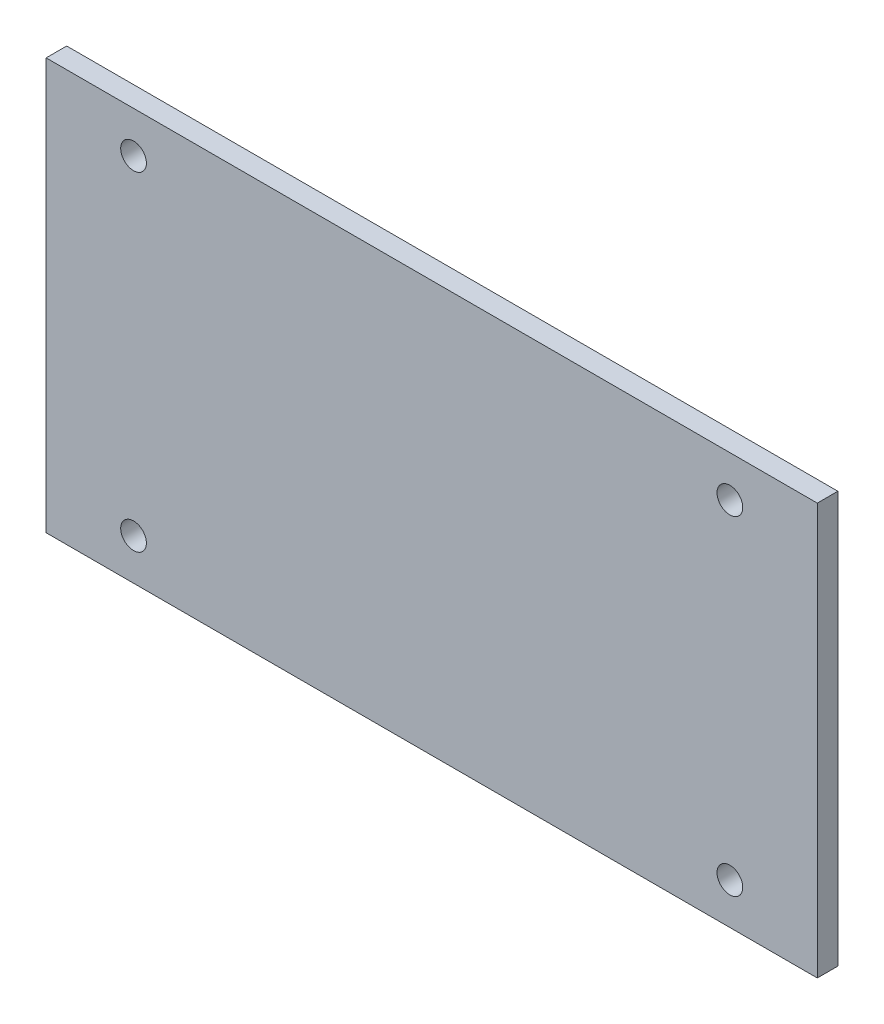
ISO-10303-21;
HEADER;
FILE_DESCRIPTION(('STEP AP214'),'2;1');
FILE_NAME('part.step','',(''),(''),'','','');
FILE_SCHEMA(('AUTOMOTIVE_DESIGN { 1 0 10303 214 1 1 1 1 }'));
ENDSEC;
DATA;
#1=APPLICATION_CONTEXT('core data for automotive mechanical design processes');
#2=APPLICATION_PROTOCOL_DEFINITION('international standard','automotive_design',2000,#1);
#3=PRODUCT_CONTEXT('',#1,'mechanical');
#4=PRODUCT('Part','Part','',(#3));
#5=PRODUCT_RELATED_PRODUCT_CATEGORY('part','',(#4));
#6=PRODUCT_DEFINITION_FORMATION('','',#4);
#7=PRODUCT_DEFINITION_CONTEXT('part definition',#1,'design');
#8=PRODUCT_DEFINITION('design','',#6,#7);
#9=PRODUCT_DEFINITION_SHAPE('','',#8);
#10=(LENGTH_UNIT() NAMED_UNIT(*) SI_UNIT(.MILLI.,.METRE.));
#11=(NAMED_UNIT(*) PLANE_ANGLE_UNIT() SI_UNIT($,.RADIAN.));
#12=(NAMED_UNIT(*) SI_UNIT($,.STERADIAN.) SOLID_ANGLE_UNIT());
#13=UNCERTAINTY_MEASURE_WITH_UNIT(LENGTH_MEASURE(1.E-05),#10,'distance_accuracy_value','');
#14=(GEOMETRIC_REPRESENTATION_CONTEXT(3) GLOBAL_UNCERTAINTY_ASSIGNED_CONTEXT((#13)) GLOBAL_UNIT_ASSIGNED_CONTEXT((#10,
#11,#12)) REPRESENTATION_CONTEXT('',''));
#15=CARTESIAN_POINT('',(0.,0.,0.));
#16=DIRECTION('',(0.,0.,1.));
#17=DIRECTION('',(1.,0.,0.));
#18=AXIS2_PLACEMENT_3D('',#15,#16,#17);
#19=CARTESIAN_POINT('',(0.,0.,4.));
#20=DIRECTION('',(0.,0.,1.));
#21=DIRECTION('',(1.,0.,0.));
#22=AXIS2_PLACEMENT_3D('',#19,#20,#21);
#23=PLANE('',#22);
#24=CARTESIAN_POINT('',(78.3442624253228,39.9499153350629,4.));
#25=DIRECTION('',(0.,0.,1.));
#26=DIRECTION('',(1.,0.,0.));
#27=AXIS2_PLACEMENT_3D('',#24,#25,#26);
#28=CIRCLE('',#27,2.50000000000001);
#29=CARTESIAN_POINT('',(80.8442624253228,39.9499153350629,4.));
#30=VERTEX_POINT('',#29);
#31=EDGE_CURVE('E121',#30,#30,#28,.T.);
#32=ORIENTED_EDGE('',*,*,#31,.F.);
#33=EDGE_LOOP('',(#32));
#34=FACE_BOUND('',#33,.T.);
#35=CARTESIAN_POINT('',(-37.6557375746772,39.9499153350629,4.));
#36=DIRECTION('',(0.,0.,1.));
#37=DIRECTION('',(1.,0.,0.));
#38=AXIS2_PLACEMENT_3D('',#35,#36,#37);
#39=CIRCLE('',#38,2.5);
#40=CARTESIAN_POINT('',(-35.1557375746772,39.9499153350629,4.));
#41=VERTEX_POINT('',#40);
#42=EDGE_CURVE('E100',#41,#41,#39,.T.);
#43=ORIENTED_EDGE('',*,*,#42,.F.);
#44=EDGE_LOOP('',(#43));
#45=FACE_BOUND('',#44,.T.);
#46=DIRECTION('',(0.,-1.,0.));
#47=VECTOR('',#46,1.);
#48=CARTESIAN_POINT('',(-54.6557375746772,47.9499153350629,4.));
#49=LINE('',#48,#47);
#50=CARTESIAN_POINT('',(-54.6557375746772,47.9499153350629,4.));
#51=VERTEX_POINT('',#50);
#52=CARTESIAN_POINT('',(-54.6557375746772,-32.0500846649371,4.));
#53=VERTEX_POINT('',#52);
#54=EDGE_CURVE('E85',#51,#53,#49,.T.);
#55=ORIENTED_EDGE('',*,*,#54,.T.);
#56=DIRECTION('',(1.,0.,0.));
#57=VECTOR('',#56,1.);
#58=CARTESIAN_POINT('',(-54.6557375746772,-32.0500846649371,4.));
#59=LINE('',#58,#57);
#60=CARTESIAN_POINT('',(95.3442624253228,-32.0500846649371,4.));
#61=VERTEX_POINT('',#60);
#62=EDGE_CURVE('E80',#53,#61,#59,.T.);
#63=ORIENTED_EDGE('',*,*,#62,.T.);
#64=DIRECTION('',(0.,1.,0.));
#65=VECTOR('',#64,1.);
#66=CARTESIAN_POINT('',(95.3442624253228,47.9499153350629,4.));
#67=LINE('',#66,#65);
#68=CARTESIAN_POINT('',(95.3442624253228,47.9499153350629,4.));
#69=VERTEX_POINT('',#68);
#70=EDGE_CURVE('E83',#61,#69,#67,.T.);
#71=ORIENTED_EDGE('',*,*,#70,.T.);
#72=DIRECTION('',(-1.,0.,0.));
#73=VECTOR('',#72,1.);
#74=CARTESIAN_POINT('',(-54.6557375746772,47.9499153350629,4.));
#75=LINE('',#74,#73);
#76=EDGE_CURVE('E50',#69,#51,#75,.T.);
#77=ORIENTED_EDGE('',*,*,#76,.T.);
#78=EDGE_LOOP('',(#55,#63,#71,#77));
#79=FACE_BOUND('',#78,.T.);
#80=CARTESIAN_POINT('',(-37.6557375746772,-24.0500846649371,4.));
#81=DIRECTION('',(0.,0.,1.));
#82=DIRECTION('',(1.,0.,0.));
#83=AXIS2_PLACEMENT_3D('',#80,#81,#82);
#84=CIRCLE('',#83,2.5);
#85=CARTESIAN_POINT('',(-35.1557375746772,-24.0500846649371,4.));
#86=VERTEX_POINT('',#85);
#87=EDGE_CURVE('E115',#86,#86,#84,.T.);
#88=ORIENTED_EDGE('',*,*,#87,.F.);
#89=EDGE_LOOP('',(#88));
#90=FACE_BOUND('',#89,.T.);
#91=CARTESIAN_POINT('',(78.3442624253228,-24.0500846649371,4.));
#92=DIRECTION('',(0.,0.,1.));
#93=DIRECTION('',(1.,0.,0.));
#94=AXIS2_PLACEMENT_3D('',#91,#92,#93);
#95=CIRCLE('',#94,2.5);
#96=CARTESIAN_POINT('',(80.8442624253228,-24.0500846649371,4.));
#97=VERTEX_POINT('',#96);
#98=EDGE_CURVE('E127',#97,#97,#95,.T.);
#99=ORIENTED_EDGE('',*,*,#98,.F.);
#100=EDGE_LOOP('',(#99));
#101=FACE_BOUND('',#100,.T.);
#102=ADVANCED_FACE('F33',(#34,#45,#79,#90,#101),#23,.T.);
#103=CARTESIAN_POINT('',(0.,0.,0.));
#104=DIRECTION('',(0.,0.,1.));
#105=DIRECTION('',(1.,0.,0.));
#106=AXIS2_PLACEMENT_3D('',#103,#104,#105);
#107=PLANE('',#106);
#108=DIRECTION('',(0.,-1.,0.));
#109=VECTOR('',#108,1.);
#110=CARTESIAN_POINT('',(-54.6557375746772,47.9499153350629,0.));
#111=LINE('',#110,#109);
#112=CARTESIAN_POINT('',(-54.6557375746772,47.9499153350629,0.));
#113=VERTEX_POINT('',#112);
#114=CARTESIAN_POINT('',(-54.6557375746772,-32.0500846649371,0.));
#115=VERTEX_POINT('',#114);
#116=EDGE_CURVE('E97',#113,#115,#111,.T.);
#117=ORIENTED_EDGE('',*,*,#116,.F.);
#118=DIRECTION('',(-1.,0.,0.));
#119=VECTOR('',#118,1.);
#120=CARTESIAN_POINT('',(-54.6557375746772,47.9499153350629,0.));
#121=LINE('',#120,#119);
#122=CARTESIAN_POINT('',(95.3442624253228,47.9499153350629,0.));
#123=VERTEX_POINT('',#122);
#124=EDGE_CURVE('E73',#123,#113,#121,.T.);
#125=ORIENTED_EDGE('',*,*,#124,.F.);
#126=DIRECTION('',(0.,1.,0.));
#127=VECTOR('',#126,1.);
#128=CARTESIAN_POINT('',(95.3442624253228,47.9499153350629,0.));
#129=LINE('',#128,#127);
#130=CARTESIAN_POINT('',(95.3442624253228,-32.0500846649371,0.));
#131=VERTEX_POINT('',#130);
#132=EDGE_CURVE('E67',#131,#123,#129,.T.);
#133=ORIENTED_EDGE('',*,*,#132,.F.);
#134=DIRECTION('',(1.,0.,0.));
#135=VECTOR('',#134,1.);
#136=CARTESIAN_POINT('',(-54.6557375746772,-32.0500846649371,0.));
#137=LINE('',#136,#135);
#138=EDGE_CURVE('E89',#115,#131,#137,.T.);
#139=ORIENTED_EDGE('',*,*,#138,.F.);
#140=EDGE_LOOP('',(#117,#125,#133,#139));
#141=FACE_BOUND('',#140,.T.);
#142=CARTESIAN_POINT('',(-37.6557375746772,39.9499153350629,0.));
#143=DIRECTION('',(0.,0.,1.));
#144=DIRECTION('',(1.,0.,0.));
#145=AXIS2_PLACEMENT_3D('',#142,#143,#144);
#146=CIRCLE('',#145,2.5);
#147=CARTESIAN_POINT('',(-35.1557375746772,39.9499153350629,0.));
#148=VERTEX_POINT('',#147);
#149=EDGE_CURVE('E112',#148,#148,#146,.T.);
#150=ORIENTED_EDGE('',*,*,#149,.T.);
#151=EDGE_LOOP('',(#150));
#152=FACE_BOUND('',#151,.T.);
#153=CARTESIAN_POINT('',(-37.6557375746772,-24.0500846649371,0.));
#154=DIRECTION('',(0.,0.,1.));
#155=DIRECTION('',(1.,0.,0.));
#156=AXIS2_PLACEMENT_3D('',#153,#154,#155);
#157=CIRCLE('',#156,2.5);
#158=CARTESIAN_POINT('',(-35.1557375746772,-24.0500846649371,0.));
#159=VERTEX_POINT('',#158);
#160=EDGE_CURVE('E118',#159,#159,#157,.T.);
#161=ORIENTED_EDGE('',*,*,#160,.T.);
#162=EDGE_LOOP('',(#161));
#163=FACE_BOUND('',#162,.T.);
#164=CARTESIAN_POINT('',(78.3442624253228,39.9499153350629,0.));
#165=DIRECTION('',(0.,0.,1.));
#166=DIRECTION('',(1.,0.,0.));
#167=AXIS2_PLACEMENT_3D('',#164,#165,#166);
#168=CIRCLE('',#167,2.50000000000001);
#169=CARTESIAN_POINT('',(80.8442624253228,39.9499153350629,0.));
#170=VERTEX_POINT('',#169);
#171=EDGE_CURVE('E124',#170,#170,#168,.T.);
#172=ORIENTED_EDGE('',*,*,#171,.T.);
#173=EDGE_LOOP('',(#172));
#174=FACE_BOUND('',#173,.T.);
#175=CARTESIAN_POINT('',(78.3442624253228,-24.0500846649371,0.));
#176=DIRECTION('',(0.,0.,1.));
#177=DIRECTION('',(1.,0.,0.));
#178=AXIS2_PLACEMENT_3D('',#175,#176,#177);
#179=CIRCLE('',#178,2.5);
#180=CARTESIAN_POINT('',(80.8442624253228,-24.0500846649371,0.));
#181=VERTEX_POINT('',#180);
#182=EDGE_CURVE('E130',#181,#181,#179,.T.);
#183=ORIENTED_EDGE('',*,*,#182,.T.);
#184=EDGE_LOOP('',(#183));
#185=FACE_BOUND('',#184,.T.);
#186=ADVANCED_FACE('F108',(#141,#152,#163,#174,#185),#107,.F.);
#187=CARTESIAN_POINT('',(-54.6557375746772,47.9499153350629,4.));
#188=DIRECTION('',(1.,0.,0.));
#189=DIRECTION('',(0.,1.,0.));
#190=AXIS2_PLACEMENT_3D('',#187,#188,#189);
#191=PLANE('',#190);
#192=ORIENTED_EDGE('',*,*,#116,.T.);
#193=DIRECTION('',(0.,0.,-1.));
#194=VECTOR('',#193,1.);
#195=CARTESIAN_POINT('',(-54.6557375746772,-32.0500846649371,4.));
#196=LINE('',#195,#194);
#197=EDGE_CURVE('E11',#53,#115,#196,.T.);
#198=ORIENTED_EDGE('',*,*,#197,.F.);
#199=ORIENTED_EDGE('',*,*,#54,.F.);
#200=DIRECTION('',(0.,0.,-1.));
#201=VECTOR('',#200,1.);
#202=CARTESIAN_POINT('',(-54.6557375746772,47.9499153350629,4.));
#203=LINE('',#202,#201);
#204=EDGE_CURVE('E93',#51,#113,#203,.T.);
#205=ORIENTED_EDGE('',*,*,#204,.T.);
#206=EDGE_LOOP('',(#192,#198,#199,#205));
#207=FACE_BOUND('',#206,.T.);
#208=ADVANCED_FACE('F35',(#207),#191,.F.);
#209=CARTESIAN_POINT('',(-54.6557375746772,-32.0500846649371,4.));
#210=DIRECTION('',(0.,1.,0.));
#211=DIRECTION('',(0.,0.,1.));
#212=AXIS2_PLACEMENT_3D('',#209,#210,#211);
#213=PLANE('',#212);
#214=ORIENTED_EDGE('',*,*,#138,.T.);
#215=DIRECTION('',(0.,0.,-1.));
#216=VECTOR('',#215,1.);
#217=CARTESIAN_POINT('',(95.3442624253228,-32.0500846649371,4.));
#218=LINE('',#217,#216);
#219=EDGE_CURVE('E42',#61,#131,#218,.T.);
#220=ORIENTED_EDGE('',*,*,#219,.F.);
#221=ORIENTED_EDGE('',*,*,#62,.F.);
#222=ORIENTED_EDGE('',*,*,#197,.T.);
#223=EDGE_LOOP('',(#214,#220,#221,#222));
#224=FACE_BOUND('',#223,.T.);
#225=ADVANCED_FACE('F88',(#224),#213,.F.);
#226=CARTESIAN_POINT('',(95.3442624253228,47.9499153350629,4.));
#227=DIRECTION('',(-1.,0.,0.));
#228=DIRECTION('',(0.,-1.,0.));
#229=AXIS2_PLACEMENT_3D('',#226,#227,#228);
#230=PLANE('',#229);
#231=ORIENTED_EDGE('',*,*,#132,.T.);
#232=DIRECTION('',(0.,0.,-1.));
#233=VECTOR('',#232,1.);
#234=CARTESIAN_POINT('',(95.3442624253228,47.9499153350629,4.));
#235=LINE('',#234,#233);
#236=EDGE_CURVE('E90',#69,#123,#235,.T.);
#237=ORIENTED_EDGE('',*,*,#236,.F.);
#238=ORIENTED_EDGE('',*,*,#70,.F.);
#239=ORIENTED_EDGE('',*,*,#219,.T.);
#240=EDGE_LOOP('',(#231,#237,#238,#239));
#241=FACE_BOUND('',#240,.T.);
#242=ADVANCED_FACE('F91',(#241),#230,.F.);
#243=CARTESIAN_POINT('',(-54.6557375746772,47.9499153350629,4.));
#244=DIRECTION('',(0.,-1.,0.));
#245=DIRECTION('',(0.,0.,-1.));
#246=AXIS2_PLACEMENT_3D('',#243,#244,#245);
#247=PLANE('',#246);
#248=ORIENTED_EDGE('',*,*,#124,.T.);
#249=ORIENTED_EDGE('',*,*,#204,.F.);
#250=ORIENTED_EDGE('',*,*,#76,.F.);
#251=ORIENTED_EDGE('',*,*,#236,.T.);
#252=EDGE_LOOP('',(#248,#249,#250,#251));
#253=FACE_BOUND('',#252,.T.);
#254=ADVANCED_FACE('F105',(#253),#247,.F.);
#255=CARTESIAN_POINT('',(-37.6557375746772,39.9499153350629,4.));
#256=DIRECTION('',(0.,0.,-1.));
#257=DIRECTION('',(-1.,0.,0.));
#258=AXIS2_PLACEMENT_3D('',#255,#256,#257);
#259=CYLINDRICAL_SURFACE('',#258,2.5);
#260=ORIENTED_EDGE('',*,*,#42,.T.);
#261=EDGE_LOOP('',(#260));
#262=FACE_BOUND('',#261,.T.);
#263=ORIENTED_EDGE('',*,*,#149,.F.);
#264=EDGE_LOOP('',(#263));
#265=FACE_BOUND('',#264,.T.);
#266=ADVANCED_FACE('F149',(#262,#265),#259,.F.);
#267=CARTESIAN_POINT('',(-37.6557375746772,-24.0500846649371,4.));
#268=DIRECTION('',(0.,0.,-1.));
#269=DIRECTION('',(-1.,0.,0.));
#270=AXIS2_PLACEMENT_3D('',#267,#268,#269);
#271=CYLINDRICAL_SURFACE('',#270,2.5);
#272=ORIENTED_EDGE('',*,*,#87,.T.);
#273=EDGE_LOOP('',(#272));
#274=FACE_BOUND('',#273,.T.);
#275=ORIENTED_EDGE('',*,*,#160,.F.);
#276=EDGE_LOOP('',(#275));
#277=FACE_BOUND('',#276,.T.);
#278=ADVANCED_FACE('F195',(#274,#277),#271,.F.);
#279=CARTESIAN_POINT('',(78.3442624253228,39.9499153350629,4.));
#280=DIRECTION('',(0.,0.,-1.));
#281=DIRECTION('',(-1.,0.,0.));
#282=AXIS2_PLACEMENT_3D('',#279,#280,#281);
#283=CYLINDRICAL_SURFACE('',#282,2.50000000000001);
#284=ORIENTED_EDGE('',*,*,#31,.T.);
#285=EDGE_LOOP('',(#284));
#286=FACE_BOUND('',#285,.T.);
#287=ORIENTED_EDGE('',*,*,#171,.F.);
#288=EDGE_LOOP('',(#287));
#289=FACE_BOUND('',#288,.T.);
#290=ADVANCED_FACE('F203',(#286,#289),#283,.F.);
#291=CARTESIAN_POINT('',(78.3442624253228,-24.0500846649371,4.));
#292=DIRECTION('',(0.,0.,-1.));
#293=DIRECTION('',(-1.,0.,0.));
#294=AXIS2_PLACEMENT_3D('',#291,#292,#293);
#295=CYLINDRICAL_SURFACE('',#294,2.5);
#296=ORIENTED_EDGE('',*,*,#98,.T.);
#297=EDGE_LOOP('',(#296));
#298=FACE_BOUND('',#297,.T.);
#299=ORIENTED_EDGE('',*,*,#182,.F.);
#300=EDGE_LOOP('',(#299));
#301=FACE_BOUND('',#300,.T.);
#302=ADVANCED_FACE('F136',(#298,#301),#295,.F.);
#303=CLOSED_SHELL('',(#102,#186,#208,#225,#242,#254,#266,#278,#290,#302));
#304=MANIFOLD_SOLID_BREP('B2',#303);
#305=ADVANCED_BREP_SHAPE_REPRESENTATION('',(#18,#304),#14);
#306=SHAPE_DEFINITION_REPRESENTATION(#9,#305);
ENDSEC;
END-ISO-10303-21;
